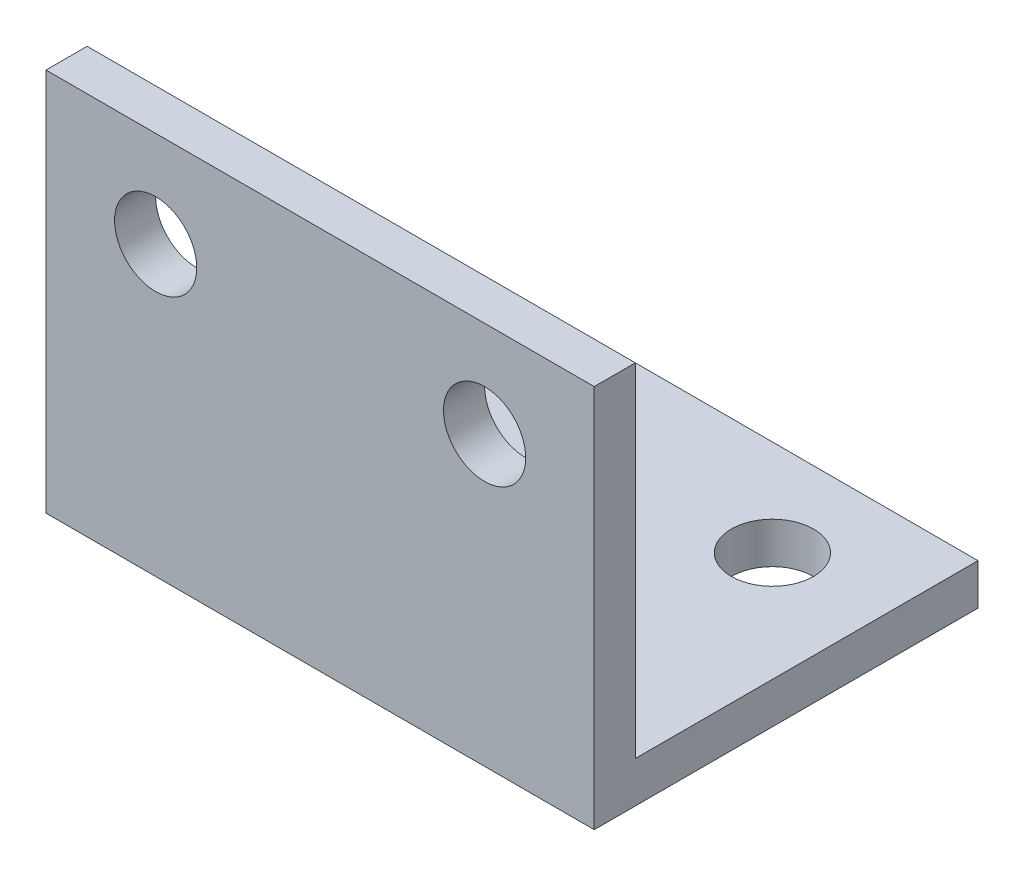
ISO-10303-21;
HEADER;
FILE_DESCRIPTION(('STEP AP214'),'2;1');
FILE_NAME('part.step','',(''),(''),'','','');
FILE_SCHEMA(('AUTOMOTIVE_DESIGN { 1 0 10303 214 1 1 1 1 }'));
ENDSEC;
DATA;
#1=APPLICATION_CONTEXT('core data for automotive mechanical design processes');
#2=APPLICATION_PROTOCOL_DEFINITION('international standard','automotive_design',2000,#1);
#3=PRODUCT_CONTEXT('',#1,'mechanical');
#4=PRODUCT('Part','Part','',(#3));
#5=PRODUCT_RELATED_PRODUCT_CATEGORY('part','',(#4));
#6=PRODUCT_DEFINITION_FORMATION('','',#4);
#7=PRODUCT_DEFINITION_CONTEXT('part definition',#1,'design');
#8=PRODUCT_DEFINITION('design','',#6,#7);
#9=PRODUCT_DEFINITION_SHAPE('','',#8);
#10=(LENGTH_UNIT() NAMED_UNIT(*) SI_UNIT(.MILLI.,.METRE.));
#11=(NAMED_UNIT(*) PLANE_ANGLE_UNIT() SI_UNIT($,.RADIAN.));
#12=(NAMED_UNIT(*) SI_UNIT($,.STERADIAN.) SOLID_ANGLE_UNIT());
#13=UNCERTAINTY_MEASURE_WITH_UNIT(LENGTH_MEASURE(1.E-05),#10,'distance_accuracy_value','');
#14=(GEOMETRIC_REPRESENTATION_CONTEXT(3) GLOBAL_UNCERTAINTY_ASSIGNED_CONTEXT((#13)) GLOBAL_UNIT_ASSIGNED_CONTEXT((#10,
#11,#12)) REPRESENTATION_CONTEXT('',''));
#15=CARTESIAN_POINT('',(0.,0.,0.));
#16=DIRECTION('',(0.,0.,1.));
#17=DIRECTION('',(1.,0.,0.));
#18=AXIS2_PLACEMENT_3D('',#15,#16,#17);
#19=CARTESIAN_POINT('',(20.0000000000005,-3.7470027081099E-13,-14.0000000000001));
#20=DIRECTION('',(0.,1.,0.));
#21=DIRECTION('',(0.,0.,1.00000000000001));
#22=AXIS2_PLACEMENT_3D('',#19,#20,#21);
#23=PLANE('',#22);
#24=CARTESIAN_POINT('',(16.0000000000003,4.02455846426619E-13,-10.5000000000003));
#25=DIRECTION('',(0.,1.,0.));
#26=DIRECTION('',(0.,0.,1.00000000000001));
#27=AXIS2_PLACEMENT_3D('',#24,#25,#26);
#28=CIRCLE('',#27,1.5);
#29=CARTESIAN_POINT('',(16.0000000000003,4.02455935113458E-13,-9.00000000000027));
#30=VERTEX_POINT('',#29);
#31=EDGE_CURVE('E164',#30,#30,#28,.T.);
#32=ORIENTED_EDGE('',*,*,#31,.T.);
#33=EDGE_LOOP('',(#32));
#34=FACE_BOUND('',#33,.T.);
#35=CARTESIAN_POINT('',(4.00000000000006,-5.41233724504764E-13,-10.5));
#36=DIRECTION('',(0.,1.,0.));
#37=DIRECTION('',(0.,0.,1.00000000000001));
#38=AXIS2_PLACEMENT_3D('',#35,#36,#37);
#39=CIRCLE('',#38,1.5);
#40=CARTESIAN_POINT('',(4.00000000000006,-5.41233635817925E-13,-8.99999999999994));
#41=VERTEX_POINT('',#40);
#42=EDGE_CURVE('E167',#41,#41,#39,.T.);
#43=ORIENTED_EDGE('',*,*,#42,.T.);
#44=EDGE_LOOP('',(#43));
#45=FACE_BOUND('',#44,.T.);
#46=DIRECTION('',(0.,0.,-1.00000000000001));
#47=VECTOR('',#46,1.);
#48=CARTESIAN_POINT('',(0.,0.,-14.));
#49=LINE('',#48,#47);
#50=CARTESIAN_POINT('',(0.,0.,0.));
#51=VERTEX_POINT('',#50);
#52=CARTESIAN_POINT('',(0.,0.,-14.));
#53=VERTEX_POINT('',#52);
#54=EDGE_CURVE('E118',#51,#53,#49,.T.);
#55=ORIENTED_EDGE('',*,*,#54,.T.);
#56=DIRECTION('',(-1.00000000000001,0.,0.));
#57=VECTOR('',#56,1.);
#58=CARTESIAN_POINT('',(20.0000000000005,-3.7470027081099E-13,-14.0000000000001));
#59=LINE('',#58,#57);
#60=CARTESIAN_POINT('',(20.0000000000005,-3.7470027081099E-13,-14.0000000000001));
#61=VERTEX_POINT('',#60);
#62=EDGE_CURVE('E11',#61,#53,#59,.T.);
#63=ORIENTED_EDGE('',*,*,#62,.F.);
#64=DIRECTION('',(0.,0.,-1.00000000000001));
#65=VECTOR('',#64,1.);
#66=CARTESIAN_POINT('',(20.0000000000005,-3.7470027081099E-13,-14.0000000000001));
#67=LINE('',#66,#65);
#68=CARTESIAN_POINT('',(20.0000000000005,1.11022302462516E-13,-1.11022302462516E-13));
#69=VERTEX_POINT('',#68);
#70=EDGE_CURVE('E129',#69,#61,#67,.T.);
#71=ORIENTED_EDGE('',*,*,#70,.F.);
#72=DIRECTION('',(-1.00000000000001,0.,0.));
#73=VECTOR('',#72,1.);
#74=CARTESIAN_POINT('',(20.0000000000005,1.11022302462516E-13,-1.11022302462516E-13));
#75=LINE('',#74,#73);
#76=EDGE_CURVE('E114',#69,#51,#75,.T.);
#77=ORIENTED_EDGE('',*,*,#76,.T.);
#78=EDGE_LOOP('',(#55,#63,#71,#77));
#79=FACE_BOUND('',#78,.T.);
#80=ADVANCED_FACE('F34',(#34,#45,#79),#23,.F.);
#81=CARTESIAN_POINT('',(20.0000000000005,1.49999999999968,-14.0000000000002));
#82=DIRECTION('',(0.,0.,1.00000000000001));
#83=DIRECTION('',(1.00000000000001,0.,0.));
#84=AXIS2_PLACEMENT_3D('',#81,#82,#83);
#85=PLANE('',#84);
#86=DIRECTION('',(0.,1.,0.));
#87=VECTOR('',#86,1.);
#88=CARTESIAN_POINT('',(2.77555756156289E-13,1.50000000000002,-14.0000000000002));
#89=LINE('',#88,#87);
#90=CARTESIAN_POINT('',(2.77555756156289E-13,1.50000000000002,-14.0000000000002));
#91=VERTEX_POINT('',#90);
#92=EDGE_CURVE('E121',#53,#91,#89,.T.);
#93=ORIENTED_EDGE('',*,*,#92,.T.);
#94=DIRECTION('',(-1.00000000000001,0.,0.));
#95=VECTOR('',#94,1.);
#96=CARTESIAN_POINT('',(20.0000000000005,1.49999999999968,-14.0000000000002));
#97=LINE('',#96,#95);
#98=CARTESIAN_POINT('',(20.0000000000005,1.49999999999968,-14.0000000000002));
#99=VERTEX_POINT('',#98);
#100=EDGE_CURVE('E42',#99,#91,#97,.T.);
#101=ORIENTED_EDGE('',*,*,#100,.F.);
#102=DIRECTION('',(0.,1.,0.));
#103=VECTOR('',#102,1.);
#104=CARTESIAN_POINT('',(20.0000000000005,1.49999999999968,-14.0000000000002));
#105=LINE('',#104,#103);
#106=EDGE_CURVE('E87',#61,#99,#105,.T.);
#107=ORIENTED_EDGE('',*,*,#106,.F.);
#108=ORIENTED_EDGE('',*,*,#62,.T.);
#109=EDGE_LOOP('',(#93,#101,#107,#108));
#110=FACE_BOUND('',#109,.T.);
#111=ADVANCED_FACE('F156',(#110),#85,.F.);
#112=CARTESIAN_POINT('',(20.0000000000001,1.50000000000039,-1.49999999999995));
#113=DIRECTION('',(0.,-1.,0.));
#114=DIRECTION('',(0.,0.,-1.00000000000001));
#115=AXIS2_PLACEMENT_3D('',#112,#113,#114);
#116=PLANE('',#115);
#117=CARTESIAN_POINT('',(16.0000000000005,1.50000000000035,-10.5000000000002));
#118=DIRECTION('',(0.,1.,0.));
#119=DIRECTION('',(0.,0.,1.00000000000001));
#120=AXIS2_PLACEMENT_3D('',#117,#118,#119);
#121=CIRCLE('',#120,1.5);
#122=CARTESIAN_POINT('',(16.0000000000005,1.50000000000035,-9.00000000000016));
#123=VERTEX_POINT('',#122);
#124=EDGE_CURVE('E178',#123,#123,#121,.T.);
#125=ORIENTED_EDGE('',*,*,#124,.F.);
#126=EDGE_LOOP('',(#125));
#127=FACE_BOUND('',#126,.T.);
#128=CARTESIAN_POINT('',(4.00000000000006,1.4999999999994,-10.5));
#129=DIRECTION('',(0.,1.,0.));
#130=DIRECTION('',(0.,0.,1.00000000000001));
#131=AXIS2_PLACEMENT_3D('',#128,#129,#130);
#132=CIRCLE('',#131,1.5);
#133=CARTESIAN_POINT('',(4.00000000000006,1.4999999999994,-8.99999999999994));
#134=VERTEX_POINT('',#133);
#135=EDGE_CURVE('E170',#134,#134,#132,.T.);
#136=ORIENTED_EDGE('',*,*,#135,.F.);
#137=EDGE_LOOP('',(#136));
#138=FACE_BOUND('',#137,.T.);
#139=DIRECTION('',(0.,0.,1.00000000000001));
#140=VECTOR('',#139,1.);
#141=CARTESIAN_POINT('',(1.11022302462516E-13,1.49999999999995,-1.50000000000028));
#142=LINE('',#141,#140);
#143=CARTESIAN_POINT('',(1.11022302462516E-13,1.49999999999995,-1.50000000000028));
#144=VERTEX_POINT('',#143);
#145=EDGE_CURVE('E124',#91,#144,#142,.T.);
#146=ORIENTED_EDGE('',*,*,#145,.T.);
#147=DIRECTION('',(-1.00000000000001,0.,0.));
#148=VECTOR('',#147,1.);
#149=CARTESIAN_POINT('',(20.0000000000001,1.50000000000039,-1.49999999999995));
#150=LINE('',#149,#148);
#151=CARTESIAN_POINT('',(20.0000000000001,1.50000000000039,-1.49999999999995));
#152=VERTEX_POINT('',#151);
#153=EDGE_CURVE('E109',#152,#144,#150,.T.);
#154=ORIENTED_EDGE('',*,*,#153,.F.);
#155=DIRECTION('',(0.,0.,1.00000000000001));
#156=VECTOR('',#155,1.);
#157=CARTESIAN_POINT('',(20.0000000000001,1.50000000000039,-1.49999999999995));
#158=LINE('',#157,#156);
#159=EDGE_CURVE('E100',#99,#152,#158,.T.);
#160=ORIENTED_EDGE('',*,*,#159,.F.);
#161=ORIENTED_EDGE('',*,*,#100,.T.);
#162=EDGE_LOOP('',(#146,#154,#160,#161));
#163=FACE_BOUND('',#162,.T.);
#164=ADVANCED_FACE('F135',(#127,#138,#163),#116,.F.);
#165=CARTESIAN_POINT('',(20.,14.,-1.50000000000006));
#166=DIRECTION('',(0.,0.,1.00000000000001));
#167=DIRECTION('',(0.,-1.,0.));
#168=AXIS2_PLACEMENT_3D('',#165,#166,#167);
#169=PLANE('',#168);
#170=CARTESIAN_POINT('',(4.00000000000023,10.5,-1.50000000000028));
#171=DIRECTION('',(0.,0.,-1.00000000000001));
#172=DIRECTION('',(0.,1.,0.));
#173=AXIS2_PLACEMENT_3D('',#170,#171,#172);
#174=CIRCLE('',#173,1.5);
#175=CARTESIAN_POINT('',(4.00000000000023,12.,-1.50000000000028));
#176=VERTEX_POINT('',#175);
#177=EDGE_CURVE('E169',#176,#176,#174,.T.);
#178=ORIENTED_EDGE('',*,*,#177,.F.);
#179=EDGE_LOOP('',(#178));
#180=FACE_BOUND('',#179,.T.);
#181=CARTESIAN_POINT('',(16.0000000000003,10.5000000000004,-1.50000000000006));
#182=DIRECTION('',(0.,0.,-1.00000000000001));
#183=DIRECTION('',(0.,1.,0.));
#184=AXIS2_PLACEMENT_3D('',#181,#182,#183);
#185=CIRCLE('',#184,1.5);
#186=CARTESIAN_POINT('',(16.0000000000003,12.0000000000004,-1.50000000000006));
#187=VERTEX_POINT('',#186);
#188=EDGE_CURVE('E181',#187,#187,#185,.T.);
#189=ORIENTED_EDGE('',*,*,#188,.F.);
#190=EDGE_LOOP('',(#189));
#191=FACE_BOUND('',#190,.T.);
#192=DIRECTION('',(0.,1.,0.));
#193=VECTOR('',#192,1.);
#194=CARTESIAN_POINT('',(1.11022302462516E-13,14.,-1.50000000000017));
#195=LINE('',#194,#193);
#196=CARTESIAN_POINT('',(1.11022302462516E-13,14.,-1.50000000000017));
#197=VERTEX_POINT('',#196);
#198=EDGE_CURVE('E108',#144,#197,#195,.T.);
#199=ORIENTED_EDGE('',*,*,#198,.T.);
#200=DIRECTION('',(-1.00000000000001,0.,0.));
#201=VECTOR('',#200,1.);
#202=CARTESIAN_POINT('',(20.,14.,-1.50000000000006));
#203=LINE('',#202,#201);
#204=CARTESIAN_POINT('',(20.,14.,-1.50000000000006));
#205=VERTEX_POINT('',#204);
#206=EDGE_CURVE('E105',#205,#197,#203,.T.);
#207=ORIENTED_EDGE('',*,*,#206,.F.);
#208=DIRECTION('',(0.,1.,0.));
#209=VECTOR('',#208,1.);
#210=CARTESIAN_POINT('',(20.,14.,-1.50000000000006));
#211=LINE('',#210,#209);
#212=EDGE_CURVE('E94',#152,#205,#211,.T.);
#213=ORIENTED_EDGE('',*,*,#212,.F.);
#214=ORIENTED_EDGE('',*,*,#153,.T.);
#215=EDGE_LOOP('',(#199,#207,#213,#214));
#216=FACE_BOUND('',#215,.T.);
#217=ADVANCED_FACE('F106',(#180,#191,#216),#169,.F.);
#218=CARTESIAN_POINT('',(20.0000000000008,13.9999999999997,-5.55111512312578E-13));
#219=DIRECTION('',(0.,-1.,0.));
#220=DIRECTION('',(0.,0.,-1.00000000000001));
#221=AXIS2_PLACEMENT_3D('',#218,#219,#220);
#222=PLANE('',#221);
#223=DIRECTION('',(0.,0.,1.00000000000001));
#224=VECTOR('',#223,1.);
#225=CARTESIAN_POINT('',(0.,14.,0.));
#226=LINE('',#225,#224);
#227=CARTESIAN_POINT('',(0.,14.,0.));
#228=VERTEX_POINT('',#227);
#229=EDGE_CURVE('E73',#197,#228,#226,.T.);
#230=ORIENTED_EDGE('',*,*,#229,.T.);
#231=DIRECTION('',(-1.00000000000001,0.,0.));
#232=VECTOR('',#231,1.);
#233=CARTESIAN_POINT('',(20.0000000000008,13.9999999999997,-5.55111512312578E-13));
#234=LINE('',#233,#232);
#235=CARTESIAN_POINT('',(20.0000000000008,13.9999999999997,-5.55111512312578E-13));
#236=VERTEX_POINT('',#235);
#237=EDGE_CURVE('E110',#236,#228,#234,.T.);
#238=ORIENTED_EDGE('',*,*,#237,.F.);
#239=DIRECTION('',(0.,0.,1.00000000000001));
#240=VECTOR('',#239,1.);
#241=CARTESIAN_POINT('',(20.0000000000008,13.9999999999997,-5.55111512312578E-13));
#242=LINE('',#241,#240);
#243=EDGE_CURVE('E98',#205,#236,#242,.T.);
#244=ORIENTED_EDGE('',*,*,#243,.F.);
#245=ORIENTED_EDGE('',*,*,#206,.T.);
#246=EDGE_LOOP('',(#230,#238,#244,#245));
#247=FACE_BOUND('',#246,.T.);
#248=ADVANCED_FACE('F112',(#247),#222,.F.);
#249=CARTESIAN_POINT('',(20.0000000000005,1.11022302462516E-13,-1.11022302462516E-13));
#250=DIRECTION('',(0.,0.,-1.00000000000001));
#251=DIRECTION('',(-1.00000000000001,0.,0.));
#252=AXIS2_PLACEMENT_3D('',#249,#250,#251);
#253=PLANE('',#252);
#254=CARTESIAN_POINT('',(4.00000000000011,10.5,0.));
#255=DIRECTION('',(0.,0.,-1.00000000000001));
#256=DIRECTION('',(0.,1.,0.));
#257=AXIS2_PLACEMENT_3D('',#254,#255,#256);
#258=CIRCLE('',#257,1.5);
#259=CARTESIAN_POINT('',(4.00000000000011,12.,0.));
#260=VERTEX_POINT('',#259);
#261=EDGE_CURVE('E173',#260,#260,#258,.T.);
#262=ORIENTED_EDGE('',*,*,#261,.T.);
#263=EDGE_LOOP('',(#262));
#264=FACE_BOUND('',#263,.T.);
#265=CARTESIAN_POINT('',(16.0000000000006,10.5000000000004,-1.11022302462516E-13));
#266=DIRECTION('',(0.,0.,-1.00000000000001));
#267=DIRECTION('',(0.,1.,0.));
#268=AXIS2_PLACEMENT_3D('',#265,#266,#267);
#269=CIRCLE('',#268,1.5);
#270=CARTESIAN_POINT('',(16.0000000000006,12.0000000000004,-1.10869149939561E-13));
#271=VERTEX_POINT('',#270);
#272=EDGE_CURVE('E122',#271,#271,#269,.T.);
#273=ORIENTED_EDGE('',*,*,#272,.T.);
#274=EDGE_LOOP('',(#273));
#275=FACE_BOUND('',#274,.T.);
#276=DIRECTION('',(0.,-1.,0.));
#277=VECTOR('',#276,1.);
#278=CARTESIAN_POINT('',(0.,0.,0.));
#279=LINE('',#278,#277);
#280=EDGE_CURVE('E79',#228,#51,#279,.T.);
#281=ORIENTED_EDGE('',*,*,#280,.T.);
#282=ORIENTED_EDGE('',*,*,#76,.F.);
#283=DIRECTION('',(0.,-1.,0.));
#284=VECTOR('',#283,1.);
#285=CARTESIAN_POINT('',(20.0000000000005,1.11022302462516E-13,-1.11022302462516E-13));
#286=LINE('',#285,#284);
#287=EDGE_CURVE('E50',#236,#69,#286,.T.);
#288=ORIENTED_EDGE('',*,*,#287,.F.);
#289=ORIENTED_EDGE('',*,*,#237,.T.);
#290=EDGE_LOOP('',(#281,#282,#288,#289));
#291=FACE_BOUND('',#290,.T.);
#292=ADVANCED_FACE('F142',(#264,#275,#291),#253,.F.);
#293=CARTESIAN_POINT('',(20.0000000000005,1.11022302462516E-13,-1.11022302462516E-13));
#294=DIRECTION('',(-1.00000000000001,0.,0.));
#295=DIRECTION('',(0.,0.,1.00000000000001));
#296=AXIS2_PLACEMENT_3D('',#293,#294,#295);
#297=PLANE('',#296);
#298=ORIENTED_EDGE('',*,*,#70,.T.);
#299=ORIENTED_EDGE('',*,*,#106,.T.);
#300=ORIENTED_EDGE('',*,*,#159,.T.);
#301=ORIENTED_EDGE('',*,*,#212,.T.);
#302=ORIENTED_EDGE('',*,*,#243,.T.);
#303=ORIENTED_EDGE('',*,*,#287,.T.);
#304=EDGE_LOOP('',(#298,#299,#300,#301,#302,#303));
#305=FACE_BOUND('',#304,.T.);
#306=ADVANCED_FACE('F96',(#305),#297,.F.);
#307=CARTESIAN_POINT('',(0.,0.,0.));
#308=DIRECTION('',(-1.00000000000001,0.,0.));
#309=DIRECTION('',(0.,0.,1.00000000000001));
#310=AXIS2_PLACEMENT_3D('',#307,#308,#309);
#311=PLANE('',#310);
#312=ORIENTED_EDGE('',*,*,#54,.F.);
#313=ORIENTED_EDGE('',*,*,#280,.F.);
#314=ORIENTED_EDGE('',*,*,#229,.F.);
#315=ORIENTED_EDGE('',*,*,#198,.F.);
#316=ORIENTED_EDGE('',*,*,#145,.F.);
#317=ORIENTED_EDGE('',*,*,#92,.F.);
#318=EDGE_LOOP('',(#312,#313,#314,#315,#316,#317));
#319=FACE_BOUND('',#318,.T.);
#320=ADVANCED_FACE('F138',(#319),#311,.T.);
#321=CARTESIAN_POINT('',(16.0000000000006,10.5000000000004,-1.11022302462516E-13));
#322=DIRECTION('',(0.,0.,-1.00000000000001));
#323=DIRECTION('',(0.,1.,0.));
#324=AXIS2_PLACEMENT_3D('',#321,#322,#323);
#325=CYLINDRICAL_SURFACE('',#324,1.5);
#326=ORIENTED_EDGE('',*,*,#272,.F.);
#327=EDGE_LOOP('',(#326));
#328=FACE_BOUND('',#327,.T.);
#329=ORIENTED_EDGE('',*,*,#188,.T.);
#330=EDGE_LOOP('',(#329));
#331=FACE_BOUND('',#330,.T.);
#332=ADVANCED_FACE('F190',(#328,#331),#325,.F.);
#333=CARTESIAN_POINT('',(4.00000000000011,10.5,0.));
#334=DIRECTION('',(0.,0.,-1.00000000000001));
#335=DIRECTION('',(0.,1.,0.));
#336=AXIS2_PLACEMENT_3D('',#333,#334,#335);
#337=CYLINDRICAL_SURFACE('',#336,1.5);
#338=ORIENTED_EDGE('',*,*,#261,.F.);
#339=EDGE_LOOP('',(#338));
#340=FACE_BOUND('',#339,.T.);
#341=ORIENTED_EDGE('',*,*,#177,.T.);
#342=EDGE_LOOP('',(#341));
#343=FACE_BOUND('',#342,.T.);
#344=ADVANCED_FACE('F202',(#340,#343),#337,.F.);
#345=CARTESIAN_POINT('',(4.00000000000006,-5.41233724504764E-13,-10.5));
#346=DIRECTION('',(0.,1.,0.));
#347=DIRECTION('',(0.,0.,1.00000000000001));
#348=AXIS2_PLACEMENT_3D('',#345,#346,#347);
#349=CYLINDRICAL_SURFACE('',#348,1.5);
#350=ORIENTED_EDGE('',*,*,#42,.F.);
#351=EDGE_LOOP('',(#350));
#352=FACE_BOUND('',#351,.T.);
#353=ORIENTED_EDGE('',*,*,#135,.T.);
#354=EDGE_LOOP('',(#353));
#355=FACE_BOUND('',#354,.T.);
#356=ADVANCED_FACE('F204',(#352,#355),#349,.F.);
#357=CARTESIAN_POINT('',(16.0000000000003,4.02455846426619E-13,-10.5000000000003));
#358=DIRECTION('',(0.,1.,0.));
#359=DIRECTION('',(0.,0.,1.00000000000001));
#360=AXIS2_PLACEMENT_3D('',#357,#358,#359);
#361=CYLINDRICAL_SURFACE('',#360,1.5);
#362=ORIENTED_EDGE('',*,*,#31,.F.);
#363=EDGE_LOOP('',(#362));
#364=FACE_BOUND('',#363,.T.);
#365=ORIENTED_EDGE('',*,*,#124,.T.);
#366=EDGE_LOOP('',(#365));
#367=FACE_BOUND('',#366,.T.);
#368=ADVANCED_FACE('F211',(#364,#367),#361,.F.);
#369=CLOSED_SHELL('',(#80,#111,#164,#217,#248,#292,#306,#320,#332,#344,#356,#368));
#370=MANIFOLD_SOLID_BREP('B2',#369);
#371=ADVANCED_BREP_SHAPE_REPRESENTATION('',(#18,#370),#14);
#372=SHAPE_DEFINITION_REPRESENTATION(#9,#371);
ENDSEC;
END-ISO-10303-21;
